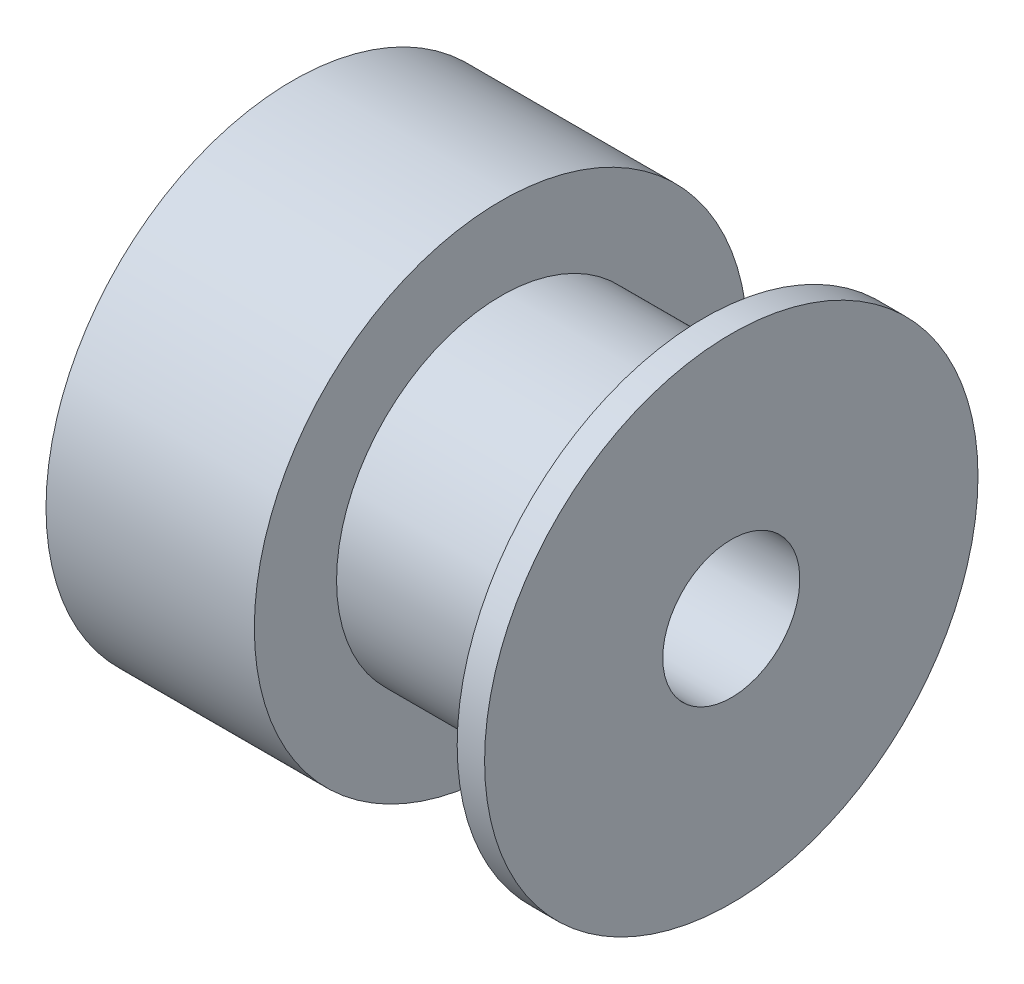
ISO-10303-21;
HEADER;
FILE_DESCRIPTION(('STEP AP214'),'2;1');
FILE_NAME('part.step','',(''),(''),'','','');
FILE_SCHEMA(('AUTOMOTIVE_DESIGN { 1 0 10303 214 1 1 1 1 }'));
ENDSEC;
DATA;
#1=APPLICATION_CONTEXT('core data for automotive mechanical design processes');
#2=APPLICATION_PROTOCOL_DEFINITION('international standard','automotive_design',2000,#1);
#3=PRODUCT_CONTEXT('',#1,'mechanical');
#4=PRODUCT('Part','Part','',(#3));
#5=PRODUCT_RELATED_PRODUCT_CATEGORY('part','',(#4));
#6=PRODUCT_DEFINITION_FORMATION('','',#4);
#7=PRODUCT_DEFINITION_CONTEXT('part definition',#1,'design');
#8=PRODUCT_DEFINITION('design','',#6,#7);
#9=PRODUCT_DEFINITION_SHAPE('','',#8);
#10=(LENGTH_UNIT() NAMED_UNIT(*) SI_UNIT(.MILLI.,.METRE.));
#11=(NAMED_UNIT(*) PLANE_ANGLE_UNIT() SI_UNIT($,.RADIAN.));
#12=(NAMED_UNIT(*) SI_UNIT($,.STERADIAN.) SOLID_ANGLE_UNIT());
#13=UNCERTAINTY_MEASURE_WITH_UNIT(LENGTH_MEASURE(1.E-05),#10,'distance_accuracy_value','');
#14=(GEOMETRIC_REPRESENTATION_CONTEXT(3) GLOBAL_UNCERTAINTY_ASSIGNED_CONTEXT((#13)) GLOBAL_UNIT_ASSIGNED_CONTEXT((#10,
#11,#12)) REPRESENTATION_CONTEXT('',''));
#15=CARTESIAN_POINT('',(0.,0.,0.));
#16=DIRECTION('',(0.,0.,1.));
#17=DIRECTION('',(1.,0.,0.));
#18=AXIS2_PLACEMENT_3D('',#15,#16,#17);
#19=CARTESIAN_POINT('',(-5.18093965240664,0.,0.));
#20=DIRECTION('',(-1.,0.,0.));
#21=DIRECTION('',(0.,0.,1.));
#22=AXIS2_PLACEMENT_3D('',#19,#20,#21);
#23=CYLINDRICAL_SURFACE('',#22,9.);
#24=CARTESIAN_POINT('',(-8.,0.,0.));
#25=DIRECTION('',(-1.,0.,0.));
#26=DIRECTION('',(0.,0.,1.));
#27=AXIS2_PLACEMENT_3D('',#24,#25,#26);
#28=CIRCLE('',#27,9.);
#29=CARTESIAN_POINT('',(-8.,0.,9.));
#30=VERTEX_POINT('',#29);
#31=EDGE_CURVE('E70',#30,#30,#28,.T.);
#32=ORIENTED_EDGE('',*,*,#31,.F.);
#33=EDGE_LOOP('',(#32));
#34=FACE_BOUND('',#33,.T.);
#35=CARTESIAN_POINT('',(-0.399999999999998,0.,0.));
#36=DIRECTION('',(-1.,0.,0.));
#37=DIRECTION('',(0.,0.,1.));
#38=AXIS2_PLACEMENT_3D('',#35,#36,#37);
#39=CIRCLE('',#38,9.);
#40=CARTESIAN_POINT('',(-0.399999999999998,0.,9.));
#41=VERTEX_POINT('',#40);
#42=EDGE_CURVE('E12',#41,#41,#39,.T.);
#43=ORIENTED_EDGE('',*,*,#42,.T.);
#44=EDGE_LOOP('',(#43));
#45=FACE_BOUND('',#44,.T.);
#46=ADVANCED_FACE('F42',(#34,#45),#23,.T.);
#47=CARTESIAN_POINT('',(-0.399999999999998,9.,0.));
#48=DIRECTION('',(-1.,0.,0.));
#49=DIRECTION('',(0.,0.,1.));
#50=AXIS2_PLACEMENT_3D('',#47,#48,#49);
#51=PLANE('',#50);
#52=ORIENTED_EDGE('',*,*,#42,.F.);
#53=EDGE_LOOP('',(#52));
#54=FACE_BOUND('',#53,.T.);
#55=CARTESIAN_POINT('',(-0.399999999999998,0.,0.));
#56=DIRECTION('',(-1.,0.,0.));
#57=DIRECTION('',(0.,0.,1.));
#58=AXIS2_PLACEMENT_3D('',#55,#56,#57);
#59=CIRCLE('',#58,6.);
#60=CARTESIAN_POINT('',(-0.399999999999998,0.,6.));
#61=VERTEX_POINT('',#60);
#62=EDGE_CURVE('E48',#61,#61,#59,.T.);
#63=ORIENTED_EDGE('',*,*,#62,.T.);
#64=EDGE_LOOP('',(#63));
#65=FACE_BOUND('',#64,.T.);
#66=ADVANCED_FACE('F77',(#54,#65),#51,.F.);
#67=CARTESIAN_POINT('',(-5.18093965240664,0.,0.));
#68=DIRECTION('',(-1.,0.,0.));
#69=DIRECTION('',(0.,0.,1.));
#70=AXIS2_PLACEMENT_3D('',#67,#68,#69);
#71=CYLINDRICAL_SURFACE('',#70,6.);
#72=ORIENTED_EDGE('',*,*,#62,.F.);
#73=EDGE_LOOP('',(#72));
#74=FACE_BOUND('',#73,.T.);
#75=CARTESIAN_POINT('',(7.,0.,0.));
#76=DIRECTION('',(-1.,0.,0.));
#77=DIRECTION('',(0.,0.,1.));
#78=AXIS2_PLACEMENT_3D('',#75,#76,#77);
#79=CIRCLE('',#78,6.);
#80=CARTESIAN_POINT('',(7.,0.,6.));
#81=VERTEX_POINT('',#80);
#82=EDGE_CURVE('E52',#81,#81,#79,.T.);
#83=ORIENTED_EDGE('',*,*,#82,.T.);
#84=EDGE_LOOP('',(#83));
#85=FACE_BOUND('',#84,.T.);
#86=ADVANCED_FACE('F81',(#74,#85),#71,.T.);
#87=CARTESIAN_POINT('',(7.,6.,0.));
#88=DIRECTION('',(1.,0.,0.));
#89=DIRECTION('',(0.,0.,-1.));
#90=AXIS2_PLACEMENT_3D('',#87,#88,#89);
#91=PLANE('',#90);
#92=ORIENTED_EDGE('',*,*,#82,.F.);
#93=EDGE_LOOP('',(#92));
#94=FACE_BOUND('',#93,.T.);
#95=CARTESIAN_POINT('',(7.,0.,0.));
#96=DIRECTION('',(-1.,0.,0.));
#97=DIRECTION('',(0.,0.,1.));
#98=AXIS2_PLACEMENT_3D('',#95,#96,#97);
#99=CIRCLE('',#98,9.);
#100=CARTESIAN_POINT('',(7.,0.,9.));
#101=VERTEX_POINT('',#100);
#102=EDGE_CURVE('E56',#101,#101,#99,.T.);
#103=ORIENTED_EDGE('',*,*,#102,.T.);
#104=EDGE_LOOP('',(#103));
#105=FACE_BOUND('',#104,.T.);
#106=ADVANCED_FACE('F86',(#94,#105),#91,.F.);
#107=CARTESIAN_POINT('',(-5.18093965240664,0.,0.));
#108=DIRECTION('',(-1.,0.,0.));
#109=DIRECTION('',(0.,0.,1.));
#110=AXIS2_PLACEMENT_3D('',#107,#108,#109);
#111=CYLINDRICAL_SURFACE('',#110,9.);
#112=ORIENTED_EDGE('',*,*,#102,.F.);
#113=EDGE_LOOP('',(#112));
#114=FACE_BOUND('',#113,.T.);
#115=CARTESIAN_POINT('',(8.,0.,0.));
#116=DIRECTION('',(-1.,0.,0.));
#117=DIRECTION('',(0.,0.,1.));
#118=AXIS2_PLACEMENT_3D('',#115,#116,#117);
#119=CIRCLE('',#118,9.);
#120=CARTESIAN_POINT('',(8.,0.,9.));
#121=VERTEX_POINT('',#120);
#122=EDGE_CURVE('E61',#121,#121,#119,.T.);
#123=ORIENTED_EDGE('',*,*,#122,.T.);
#124=EDGE_LOOP('',(#123));
#125=FACE_BOUND('',#124,.T.);
#126=ADVANCED_FACE('F92',(#114,#125),#111,.T.);
#127=CARTESIAN_POINT('',(8.,2.5,0.));
#128=DIRECTION('',(-1.,0.,0.));
#129=DIRECTION('',(0.,0.,1.));
#130=AXIS2_PLACEMENT_3D('',#127,#128,#129);
#131=PLANE('',#130);
#132=ORIENTED_EDGE('',*,*,#122,.F.);
#133=EDGE_LOOP('',(#132));
#134=FACE_BOUND('',#133,.T.);
#135=CARTESIAN_POINT('',(8.,0.,0.));
#136=DIRECTION('',(-1.,0.,0.));
#137=DIRECTION('',(0.,0.,1.));
#138=AXIS2_PLACEMENT_3D('',#135,#136,#137);
#139=CIRCLE('',#138,2.5);
#140=CARTESIAN_POINT('',(8.,0.,2.5));
#141=VERTEX_POINT('',#140);
#142=EDGE_CURVE('E64',#141,#141,#139,.T.);
#143=ORIENTED_EDGE('',*,*,#142,.T.);
#144=EDGE_LOOP('',(#143));
#145=FACE_BOUND('',#144,.T.);
#146=ADVANCED_FACE('F96',(#134,#145),#131,.F.);
#147=CARTESIAN_POINT('',(-5.18093965240664,0.,0.));
#148=DIRECTION('',(-1.,0.,0.));
#149=DIRECTION('',(0.,0.,1.));
#150=AXIS2_PLACEMENT_3D('',#147,#148,#149);
#151=CYLINDRICAL_SURFACE('',#150,2.5);
#152=ORIENTED_EDGE('',*,*,#142,.F.);
#153=EDGE_LOOP('',(#152));
#154=FACE_BOUND('',#153,.T.);
#155=CARTESIAN_POINT('',(-8.,0.,0.));
#156=DIRECTION('',(-1.,0.,0.));
#157=DIRECTION('',(0.,0.,1.));
#158=AXIS2_PLACEMENT_3D('',#155,#156,#157);
#159=CIRCLE('',#158,2.5);
#160=CARTESIAN_POINT('',(-8.,0.,2.5));
#161=VERTEX_POINT('',#160);
#162=EDGE_CURVE('E67',#161,#161,#159,.T.);
#163=ORIENTED_EDGE('',*,*,#162,.T.);
#164=EDGE_LOOP('',(#163));
#165=FACE_BOUND('',#164,.T.);
#166=ADVANCED_FACE('F100',(#154,#165),#151,.F.);
#167=CARTESIAN_POINT('',(-8.,2.5,0.));
#168=DIRECTION('',(1.,0.,0.));
#169=DIRECTION('',(0.,0.,-1.));
#170=AXIS2_PLACEMENT_3D('',#167,#168,#169);
#171=PLANE('',#170);
#172=ORIENTED_EDGE('',*,*,#162,.F.);
#173=EDGE_LOOP('',(#172));
#174=FACE_BOUND('',#173,.T.);
#175=ORIENTED_EDGE('',*,*,#31,.T.);
#176=EDGE_LOOP('',(#175));
#177=FACE_BOUND('',#176,.T.);
#178=ADVANCED_FACE('F74',(#174,#177),#171,.F.);
#179=CLOSED_SHELL('',(#46,#66,#86,#106,#126,#146,#166,#178));
#180=MANIFOLD_SOLID_BREP('B2',#179);
#181=ADVANCED_BREP_SHAPE_REPRESENTATION('',(#18,#180),#14);
#182=SHAPE_DEFINITION_REPRESENTATION(#9,#181);
ENDSEC;
END-ISO-10303-21;
